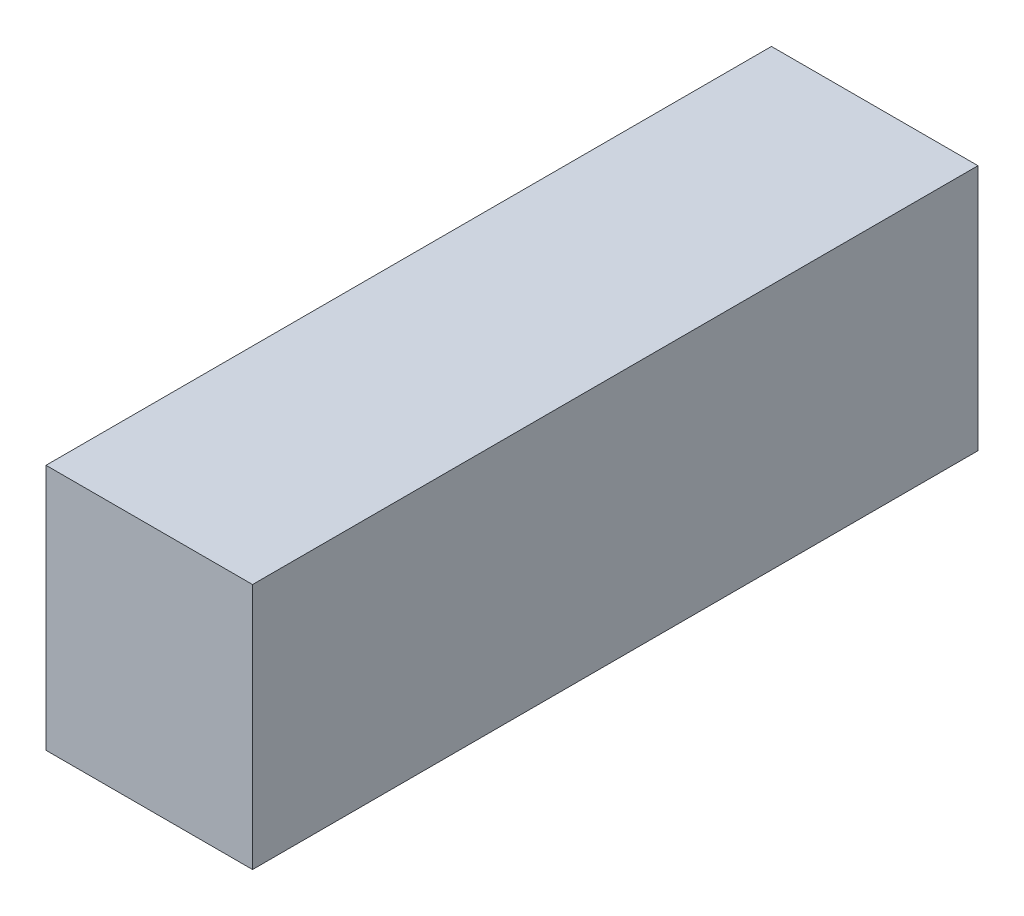
ISO-10303-21;
HEADER;
FILE_DESCRIPTION(('STEP AP214'),'2;1');
FILE_NAME('part.step','',(''),(''),'','','');
FILE_SCHEMA(('AUTOMOTIVE_DESIGN { 1 0 10303 214 1 1 1 1 }'));
ENDSEC;
DATA;
#1=APPLICATION_CONTEXT('core data for automotive mechanical design processes');
#2=APPLICATION_PROTOCOL_DEFINITION('international standard','automotive_design',2000,#1);
#3=PRODUCT_CONTEXT('',#1,'mechanical');
#4=PRODUCT('Part','Part','',(#3));
#5=PRODUCT_RELATED_PRODUCT_CATEGORY('part','',(#4));
#6=PRODUCT_DEFINITION_FORMATION('','',#4);
#7=PRODUCT_DEFINITION_CONTEXT('part definition',#1,'design');
#8=PRODUCT_DEFINITION('design','',#6,#7);
#9=PRODUCT_DEFINITION_SHAPE('','',#8);
#10=(LENGTH_UNIT() NAMED_UNIT(*) SI_UNIT(.MILLI.,.METRE.));
#11=(NAMED_UNIT(*) PLANE_ANGLE_UNIT() SI_UNIT($,.RADIAN.));
#12=(NAMED_UNIT(*) SI_UNIT($,.STERADIAN.) SOLID_ANGLE_UNIT());
#13=UNCERTAINTY_MEASURE_WITH_UNIT(LENGTH_MEASURE(1.E-05),#10,'distance_accuracy_value','');
#14=(GEOMETRIC_REPRESENTATION_CONTEXT(3) GLOBAL_UNCERTAINTY_ASSIGNED_CONTEXT((#13)) GLOBAL_UNIT_ASSIGNED_CONTEXT((#10,
#11,#12)) REPRESENTATION_CONTEXT('',''));
#15=CARTESIAN_POINT('',(0.,0.,0.));
#16=DIRECTION('',(0.,0.,1.));
#17=DIRECTION('',(1.,0.,0.));
#18=AXIS2_PLACEMENT_3D('',#15,#16,#17);
#19=CARTESIAN_POINT('',(20.5,49.,-72.));
#20=DIRECTION('',(-1.,0.,0.));
#21=DIRECTION('',(0.,0.,1.));
#22=AXIS2_PLACEMENT_3D('',#19,#20,#21);
#23=PLANE('',#22);
#24=DIRECTION('',(0.,0.,-1.));
#25=VECTOR('',#24,1.);
#26=CARTESIAN_POINT('',(20.5,0.,-72.));
#27=LINE('',#26,#25);
#28=CARTESIAN_POINT('',(20.5,0.,72.));
#29=VERTEX_POINT('',#28);
#30=CARTESIAN_POINT('',(20.5,0.,-72.));
#31=VERTEX_POINT('',#30);
#32=EDGE_CURVE('E95',#29,#31,#27,.T.);
#33=ORIENTED_EDGE('',*,*,#32,.T.);
#34=DIRECTION('',(0.,-1.,0.));
#35=VECTOR('',#34,1.);
#36=CARTESIAN_POINT('',(20.5,49.,-72.));
#37=LINE('',#36,#35);
#38=CARTESIAN_POINT('',(20.5,49.,-72.));
#39=VERTEX_POINT('',#38);
#40=EDGE_CURVE('E11',#39,#31,#37,.T.);
#41=ORIENTED_EDGE('',*,*,#40,.F.);
#42=DIRECTION('',(0.,0.,-1.));
#43=VECTOR('',#42,1.);
#44=CARTESIAN_POINT('',(20.5,49.,-72.));
#45=LINE('',#44,#43);
#46=CARTESIAN_POINT('',(20.5,49.,72.));
#47=VERTEX_POINT('',#46);
#48=EDGE_CURVE('E83',#47,#39,#45,.T.);
#49=ORIENTED_EDGE('',*,*,#48,.F.);
#50=DIRECTION('',(0.,-1.,0.));
#51=VECTOR('',#50,1.);
#52=CARTESIAN_POINT('',(20.5,49.,72.));
#53=LINE('',#52,#51);
#54=EDGE_CURVE('E91',#47,#29,#53,.T.);
#55=ORIENTED_EDGE('',*,*,#54,.T.);
#56=EDGE_LOOP('',(#33,#41,#49,#55));
#57=FACE_BOUND('',#56,.T.);
#58=ADVANCED_FACE('F32',(#57),#23,.F.);
#59=CARTESIAN_POINT('',(-20.5,49.,-72.));
#60=DIRECTION('',(0.,0.,1.));
#61=DIRECTION('',(1.,0.,0.));
#62=AXIS2_PLACEMENT_3D('',#59,#60,#61);
#63=PLANE('',#62);
#64=DIRECTION('',(-1.,0.,0.));
#65=VECTOR('',#64,1.);
#66=CARTESIAN_POINT('',(-20.5,0.,-72.));
#67=LINE('',#66,#65);
#68=CARTESIAN_POINT('',(-20.5,0.,-72.));
#69=VERTEX_POINT('',#68);
#70=EDGE_CURVE('E87',#31,#69,#67,.T.);
#71=ORIENTED_EDGE('',*,*,#70,.T.);
#72=DIRECTION('',(0.,-1.,0.));
#73=VECTOR('',#72,1.);
#74=CARTESIAN_POINT('',(-20.5,49.,-72.));
#75=LINE('',#74,#73);
#76=CARTESIAN_POINT('',(-20.5,49.,-72.));
#77=VERTEX_POINT('',#76);
#78=EDGE_CURVE('E40',#77,#69,#75,.T.);
#79=ORIENTED_EDGE('',*,*,#78,.F.);
#80=DIRECTION('',(-1.,0.,0.));
#81=VECTOR('',#80,1.);
#82=CARTESIAN_POINT('',(-20.5,49.,-72.));
#83=LINE('',#82,#81);
#84=EDGE_CURVE('E78',#39,#77,#83,.T.);
#85=ORIENTED_EDGE('',*,*,#84,.F.);
#86=ORIENTED_EDGE('',*,*,#40,.T.);
#87=EDGE_LOOP('',(#71,#79,#85,#86));
#88=FACE_BOUND('',#87,.T.);
#89=ADVANCED_FACE('F86',(#88),#63,.F.);
#90=CARTESIAN_POINT('',(-20.5,49.,-72.));
#91=DIRECTION('',(1.,0.,0.));
#92=DIRECTION('',(0.,0.,-1.));
#93=AXIS2_PLACEMENT_3D('',#90,#91,#92);
#94=PLANE('',#93);
#95=DIRECTION('',(0.,0.,1.));
#96=VECTOR('',#95,1.);
#97=CARTESIAN_POINT('',(-20.5,0.,-72.));
#98=LINE('',#97,#96);
#99=CARTESIAN_POINT('',(-20.5,0.,72.));
#100=VERTEX_POINT('',#99);
#101=EDGE_CURVE('E65',#69,#100,#98,.T.);
#102=ORIENTED_EDGE('',*,*,#101,.T.);
#103=DIRECTION('',(0.,-1.,0.));
#104=VECTOR('',#103,1.);
#105=CARTESIAN_POINT('',(-20.5,49.,72.));
#106=LINE('',#105,#104);
#107=CARTESIAN_POINT('',(-20.5,49.,72.));
#108=VERTEX_POINT('',#107);
#109=EDGE_CURVE('E88',#108,#100,#106,.T.);
#110=ORIENTED_EDGE('',*,*,#109,.F.);
#111=DIRECTION('',(0.,0.,1.));
#112=VECTOR('',#111,1.);
#113=CARTESIAN_POINT('',(-20.5,49.,-72.));
#114=LINE('',#113,#112);
#115=EDGE_CURVE('E81',#77,#108,#114,.T.);
#116=ORIENTED_EDGE('',*,*,#115,.F.);
#117=ORIENTED_EDGE('',*,*,#78,.T.);
#118=EDGE_LOOP('',(#102,#110,#116,#117));
#119=FACE_BOUND('',#118,.T.);
#120=ADVANCED_FACE('F89',(#119),#94,.F.);
#121=CARTESIAN_POINT('',(-20.5,49.,72.));
#122=DIRECTION('',(0.,0.,-1.));
#123=DIRECTION('',(-1.,0.,0.));
#124=AXIS2_PLACEMENT_3D('',#121,#122,#123);
#125=PLANE('',#124);
#126=DIRECTION('',(1.,0.,0.));
#127=VECTOR('',#126,1.);
#128=CARTESIAN_POINT('',(-20.5,0.,72.));
#129=LINE('',#128,#127);
#130=EDGE_CURVE('E71',#100,#29,#129,.T.);
#131=ORIENTED_EDGE('',*,*,#130,.T.);
#132=ORIENTED_EDGE('',*,*,#54,.F.);
#133=DIRECTION('',(1.,0.,0.));
#134=VECTOR('',#133,1.);
#135=CARTESIAN_POINT('',(-20.5,49.,72.));
#136=LINE('',#135,#134);
#137=EDGE_CURVE('E48',#108,#47,#136,.T.);
#138=ORIENTED_EDGE('',*,*,#137,.F.);
#139=ORIENTED_EDGE('',*,*,#109,.T.);
#140=EDGE_LOOP('',(#131,#132,#138,#139));
#141=FACE_BOUND('',#140,.T.);
#142=ADVANCED_FACE('F102',(#141),#125,.F.);
#143=CARTESIAN_POINT('',(0.,49.,0.));
#144=DIRECTION('',(0.,1.,0.));
#145=DIRECTION('',(0.,0.,1.));
#146=AXIS2_PLACEMENT_3D('',#143,#144,#145);
#147=PLANE('',#146);
#148=ORIENTED_EDGE('',*,*,#48,.T.);
#149=ORIENTED_EDGE('',*,*,#84,.T.);
#150=ORIENTED_EDGE('',*,*,#115,.T.);
#151=ORIENTED_EDGE('',*,*,#137,.T.);
#152=EDGE_LOOP('',(#148,#149,#150,#151));
#153=FACE_BOUND('',#152,.T.);
#154=ADVANCED_FACE('F79',(#153),#147,.T.);
#155=CARTESIAN_POINT('',(0.,0.,0.));
#156=DIRECTION('',(0.,1.,0.));
#157=DIRECTION('',(0.,0.,1.));
#158=AXIS2_PLACEMENT_3D('',#155,#156,#157);
#159=PLANE('',#158);
#160=ORIENTED_EDGE('',*,*,#32,.F.);
#161=ORIENTED_EDGE('',*,*,#130,.F.);
#162=ORIENTED_EDGE('',*,*,#101,.F.);
#163=ORIENTED_EDGE('',*,*,#70,.F.);
#164=EDGE_LOOP('',(#160,#161,#162,#163));
#165=FACE_BOUND('',#164,.T.);
#166=ADVANCED_FACE('F105',(#165),#159,.F.);
#167=CLOSED_SHELL('',(#58,#89,#120,#142,#154,#166));
#168=MANIFOLD_SOLID_BREP('B2',#167);
#169=ADVANCED_BREP_SHAPE_REPRESENTATION('',(#18,#168),#14);
#170=SHAPE_DEFINITION_REPRESENTATION(#9,#169);
ENDSEC;
END-ISO-10303-21;
